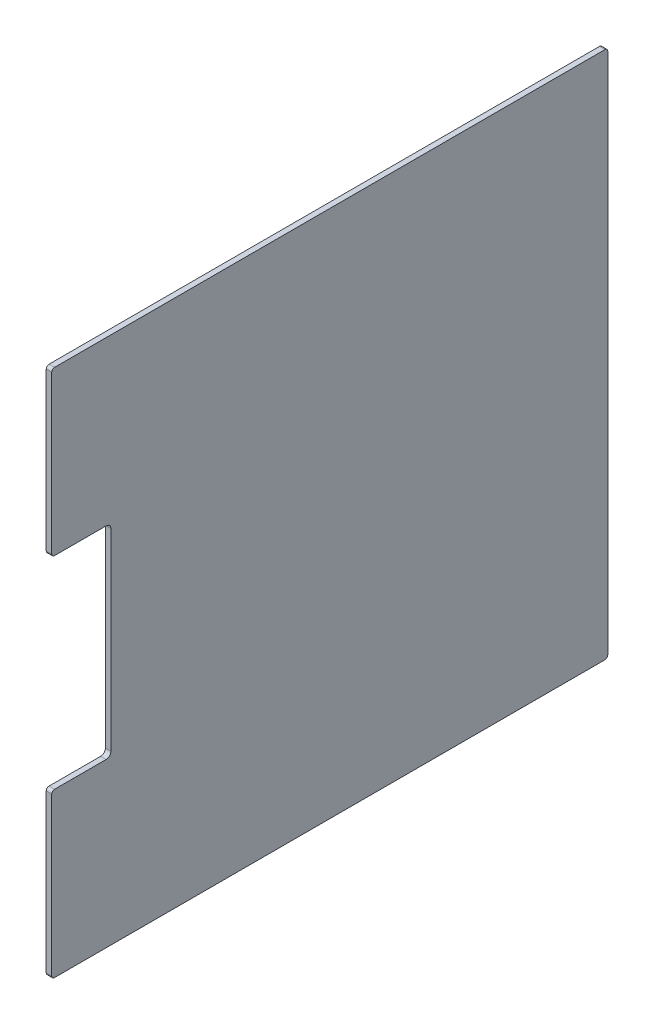
ISO-10303-21;
HEADER;
FILE_DESCRIPTION(('STEP AP214'),'2;1');
FILE_NAME('part.step','',(''),(''),'','','');
FILE_SCHEMA(('AUTOMOTIVE_DESIGN { 1 0 10303 214 1 1 1 1 }'));
ENDSEC;
DATA;
#1=APPLICATION_CONTEXT('core data for automotive mechanical design processes');
#2=APPLICATION_PROTOCOL_DEFINITION('international standard','automotive_design',2000,#1);
#3=PRODUCT_CONTEXT('',#1,'mechanical');
#4=PRODUCT('Part','Part','',(#3));
#5=PRODUCT_RELATED_PRODUCT_CATEGORY('part','',(#4));
#6=PRODUCT_DEFINITION_FORMATION('','',#4);
#7=PRODUCT_DEFINITION_CONTEXT('part definition',#1,'design');
#8=PRODUCT_DEFINITION('design','',#6,#7);
#9=PRODUCT_DEFINITION_SHAPE('','',#8);
#10=(LENGTH_UNIT() NAMED_UNIT(*) SI_UNIT(.MILLI.,.METRE.));
#11=(NAMED_UNIT(*) PLANE_ANGLE_UNIT() SI_UNIT($,.RADIAN.));
#12=(NAMED_UNIT(*) SI_UNIT($,.STERADIAN.) SOLID_ANGLE_UNIT());
#13=UNCERTAINTY_MEASURE_WITH_UNIT(LENGTH_MEASURE(1.E-05),#10,'distance_accuracy_value','');
#14=(GEOMETRIC_REPRESENTATION_CONTEXT(3) GLOBAL_UNCERTAINTY_ASSIGNED_CONTEXT((#13)) GLOBAL_UNIT_ASSIGNED_CONTEXT((#10,
#11,#12)) REPRESENTATION_CONTEXT('',''));
#15=CARTESIAN_POINT('',(0.,0.,0.));
#16=DIRECTION('',(0.,0.,1.));
#17=DIRECTION('',(1.,0.,0.));
#18=AXIS2_PLACEMENT_3D('',#15,#16,#17);
#19=CARTESIAN_POINT('',(-22.4931809643749,28.9773858907143,-41.9999994337558));
#20=DIRECTION('',(0.,0.,-1.));
#21=DIRECTION('',(0.,-1.,0.));
#22=AXIS2_PLACEMENT_3D('',#19,#20,#21);
#23=PLANE('',#22);
#24=DIRECTION('',(1.,0.,0.));
#25=VECTOR('',#24,1.);
#26=CARTESIAN_POINT('',(-22.493180964376,-353.022614019876,-41.9999994337558));
#27=LINE('',#26,#25);
#28=CARTESIAN_POINT('',(-26.493180964376,-353.022614019876,-41.9999994337558));
#29=VERTEX_POINT('',#28);
#30=CARTESIAN_POINT('',(-22.493180964376,-353.022614019876,-41.9999994337558));
#31=VERTEX_POINT('',#30);
#32=EDGE_CURVE('E258',#29,#31,#27,.T.);
#33=ORIENTED_EDGE('',*,*,#32,.F.);
#34=DIRECTION('',(0.,-1.,0.));
#35=VECTOR('',#34,1.);
#36=CARTESIAN_POINT('',(-26.4931809643749,28.9773858907143,-41.9999994337558));
#37=LINE('',#36,#35);
#38=CARTESIAN_POINT('',(-26.4931809643749,26.9773858907143,-41.9999994337558));
#39=VERTEX_POINT('',#38);
#40=EDGE_CURVE('E223',#39,#29,#37,.T.);
#41=ORIENTED_EDGE('',*,*,#40,.F.);
#42=DIRECTION('',(-1.,0.,0.));
#43=VECTOR('',#42,1.);
#44=CARTESIAN_POINT('',(-22.493180964375,26.9773858907143,-41.9999994337558));
#45=LINE('',#44,#43);
#46=CARTESIAN_POINT('',(-22.4931809643749,26.9773858907143,-41.9999994337558));
#47=VERTEX_POINT('',#46);
#48=EDGE_CURVE('E257',#47,#39,#45,.T.);
#49=ORIENTED_EDGE('',*,*,#48,.F.);
#50=DIRECTION('',(0.,-1.,0.));
#51=VECTOR('',#50,1.);
#52=CARTESIAN_POINT('',(-22.4931809643749,28.9773858907143,-41.9999994337558));
#53=LINE('',#52,#51);
#54=EDGE_CURVE('E203',#47,#31,#53,.T.);
#55=ORIENTED_EDGE('',*,*,#54,.T.);
#56=EDGE_LOOP('',(#33,#41,#49,#55));
#57=FACE_BOUND('',#56,.T.);
#58=ADVANCED_FACE('F17',(#57),#23,.T.);
#59=CARTESIAN_POINT('',(-26.4931809643756,-236.499667693611,362.000000476835));
#60=DIRECTION('',(0.,-1.,0.));
#61=DIRECTION('',(-1.,0.,0.));
#62=AXIS2_PLACEMENT_3D('',#59,#60,#61);
#63=PLANE('',#62);
#64=DIRECTION('',(-1.,0.,0.));
#65=VECTOR('',#64,1.);
#66=CARTESIAN_POINT('',(-24.4931809643758,-236.499667693611,360.000000476835));
#67=LINE('',#66,#65);
#68=CARTESIAN_POINT('',(-22.4931809643758,-236.499667693611,360.000000476835));
#69=VERTEX_POINT('',#68);
#70=CARTESIAN_POINT('',(-26.4931809643756,-236.499667693611,360.000000476835));
#71=VERTEX_POINT('',#70);
#72=EDGE_CURVE('E283',#69,#71,#67,.T.);
#73=ORIENTED_EDGE('',*,*,#72,.F.);
#74=DIRECTION('',(0.,0.,1.));
#75=VECTOR('',#74,1.);
#76=CARTESIAN_POINT('',(-22.4931809643758,-236.499667693611,322.5));
#77=LINE('',#76,#75);
#78=CARTESIAN_POINT('',(-22.4931809643758,-236.499667693611,322.5));
#79=VERTEX_POINT('',#78);
#80=EDGE_CURVE('E232',#79,#69,#77,.T.);
#81=ORIENTED_EDGE('',*,*,#80,.F.);
#82=DIRECTION('',(1.,0.,0.));
#83=VECTOR('',#82,1.);
#84=CARTESIAN_POINT('',(-26.4931809643756,-236.499667693611,322.5));
#85=LINE('',#84,#83);
#86=CARTESIAN_POINT('',(-26.4931809643756,-236.499667693611,322.5));
#87=VERTEX_POINT('',#86);
#88=EDGE_CURVE('E304',#87,#79,#85,.T.);
#89=ORIENTED_EDGE('',*,*,#88,.F.);
#90=DIRECTION('',(0.,0.,-1.));
#91=VECTOR('',#90,1.);
#92=CARTESIAN_POINT('',(-26.4931809643756,-236.499667693611,362.000000476835));
#93=LINE('',#92,#91);
#94=EDGE_CURVE('E205',#71,#87,#93,.T.);
#95=ORIENTED_EDGE('',*,*,#94,.F.);
#96=EDGE_LOOP('',(#73,#81,#89,#95));
#97=FACE_BOUND('',#96,.T.);
#98=ADVANCED_FACE('F375',(#97),#63,.F.);
#99=CARTESIAN_POINT('',(-26.4931809643752,-89.4996676936113,322.9));
#100=DIRECTION('',(0.,1.,0.));
#101=DIRECTION('',(0.,0.,-1.));
#102=AXIS2_PLACEMENT_3D('',#99,#100,#101);
#103=PLANE('',#102);
#104=DIRECTION('',(1.,0.,0.));
#105=VECTOR('',#104,1.);
#106=CARTESIAN_POINT('',(-24.4931809643757,-89.4996676936113,360.000000476835));
#107=LINE('',#106,#105);
#108=CARTESIAN_POINT('',(-26.4931809643752,-89.4996676936113,360.000000476835));
#109=VERTEX_POINT('',#108);
#110=CARTESIAN_POINT('',(-22.4931809643753,-89.4996676936113,360.000000476835));
#111=VERTEX_POINT('',#110);
#112=EDGE_CURVE('E285',#109,#111,#107,.T.);
#113=ORIENTED_EDGE('',*,*,#112,.F.);
#114=DIRECTION('',(0.,0.,1.));
#115=VECTOR('',#114,1.);
#116=CARTESIAN_POINT('',(-26.4931809643752,-89.4996676936113,322.5));
#117=LINE('',#116,#115);
#118=CARTESIAN_POINT('',(-26.4931809643752,-89.4996676936113,322.5));
#119=VERTEX_POINT('',#118);
#120=EDGE_CURVE('E310',#119,#109,#117,.T.);
#121=ORIENTED_EDGE('',*,*,#120,.F.);
#122=DIRECTION('',(-1.,0.,0.));
#123=VECTOR('',#122,1.);
#124=CARTESIAN_POINT('',(-22.4931809643754,-89.4996676936113,322.5));
#125=LINE('',#124,#123);
#126=CARTESIAN_POINT('',(-22.4931809643754,-89.4996676936113,322.5));
#127=VERTEX_POINT('',#126);
#128=EDGE_CURVE('E11',#127,#119,#125,.T.);
#129=ORIENTED_EDGE('',*,*,#128,.F.);
#130=DIRECTION('',(0.,0.,-1.));
#131=VECTOR('',#130,1.);
#132=CARTESIAN_POINT('',(-22.4931809643753,-89.4996676936113,362.000000476835));
#133=LINE('',#132,#131);
#134=EDGE_CURVE('E220',#111,#127,#133,.T.);
#135=ORIENTED_EDGE('',*,*,#134,.F.);
#136=EDGE_LOOP('',(#113,#121,#129,#135));
#137=FACE_BOUND('',#136,.T.);
#138=ADVANCED_FACE('F366',(#137),#103,.F.);
#139=CARTESIAN_POINT('',(-26.4931809643752,-92.9996676936113,322.5));
#140=DIRECTION('',(-1.,0.,0.));
#141=DIRECTION('',(0.,0.707106781186551,-0.707106781186544));
#142=AXIS2_PLACEMENT_3D('',#139,#140,#141);
#143=CYLINDRICAL_SURFACE('',#142,3.5);
#144=CARTESIAN_POINT('',(-22.4931809643755,-92.9996676936113,322.5));
#145=DIRECTION('',(1.,0.,0.));
#146=DIRECTION('',(0.,0.707106781186551,-0.707106781186544));
#147=AXIS2_PLACEMENT_3D('',#144,#145,#146);
#148=CIRCLE('',#147,3.5);
#149=CARTESIAN_POINT('',(-22.4931809643754,-92.9996676936113,319.));
#150=VERTEX_POINT('',#149);
#151=EDGE_CURVE('E216',#150,#127,#148,.T.);
#152=ORIENTED_EDGE('',*,*,#151,.T.);
#153=ORIENTED_EDGE('',*,*,#128,.T.);
#154=CARTESIAN_POINT('',(-26.4931809643754,-92.9996676936113,322.5));
#155=DIRECTION('',(-1.,0.,0.));
#156=DIRECTION('',(0.,0.707106781186551,-0.707106781186544));
#157=AXIS2_PLACEMENT_3D('',#154,#155,#156);
#158=CIRCLE('',#157,3.5);
#159=CARTESIAN_POINT('',(-26.4931809643752,-92.9996676936113,319.));
#160=VERTEX_POINT('',#159);
#161=EDGE_CURVE('E313',#119,#160,#158,.T.);
#162=ORIENTED_EDGE('',*,*,#161,.T.);
#163=DIRECTION('',(1.,0.,0.));
#164=VECTOR('',#163,1.);
#165=CARTESIAN_POINT('',(-26.4931809643752,-92.9996676936113,319.));
#166=LINE('',#165,#164);
#167=EDGE_CURVE('E28',#160,#150,#166,.T.);
#168=ORIENTED_EDGE('',*,*,#167,.T.);
#169=EDGE_LOOP('',(#152,#153,#162,#168));
#170=FACE_BOUND('',#169,.T.);
#171=ADVANCED_FACE('F364',(#170),#143,.F.);
#172=CARTESIAN_POINT('',(-26.4931809643753,-98.7996676936113,319.));
#173=DIRECTION('',(0.,0.,-1.));
#174=DIRECTION('',(0.,-1.,0.));
#175=AXIS2_PLACEMENT_3D('',#172,#173,#174);
#176=PLANE('',#175);
#177=DIRECTION('',(-1.,0.,0.));
#178=VECTOR('',#177,1.);
#179=CARTESIAN_POINT('',(-22.4931809643758,-232.999667693611,319.));
#180=LINE('',#179,#178);
#181=CARTESIAN_POINT('',(-22.4931809643758,-232.999667693611,319.));
#182=VERTEX_POINT('',#181);
#183=CARTESIAN_POINT('',(-26.4931809643756,-232.999667693611,319.));
#184=VERTEX_POINT('',#183);
#185=EDGE_CURVE('E264',#182,#184,#180,.T.);
#186=ORIENTED_EDGE('',*,*,#185,.F.);
#187=DIRECTION('',(0.,-1.,0.));
#188=VECTOR('',#187,1.);
#189=CARTESIAN_POINT('',(-22.4931809643754,-92.9996676936113,319.));
#190=LINE('',#189,#188);
#191=EDGE_CURVE('E219',#150,#182,#190,.T.);
#192=ORIENTED_EDGE('',*,*,#191,.F.);
#193=ORIENTED_EDGE('',*,*,#167,.F.);
#194=DIRECTION('',(0.,1.,0.));
#195=VECTOR('',#194,1.);
#196=CARTESIAN_POINT('',(-26.4931809643756,-232.999667693611,319.));
#197=LINE('',#196,#195);
#198=EDGE_CURVE('E274',#184,#160,#197,.T.);
#199=ORIENTED_EDGE('',*,*,#198,.F.);
#200=EDGE_LOOP('',(#186,#192,#193,#199));
#201=FACE_BOUND('',#200,.T.);
#202=ADVANCED_FACE('F360',(#201),#176,.F.);
#203=CARTESIAN_POINT('',(-26.4931809643754,-232.999667693611,322.5));
#204=DIRECTION('',(-1.,0.,0.));
#205=DIRECTION('',(0.,-0.70710678118654,-0.707106781186555));
#206=AXIS2_PLACEMENT_3D('',#203,#204,#205);
#207=CYLINDRICAL_SURFACE('',#206,3.5);
#208=CARTESIAN_POINT('',(-22.4931809643755,-232.999667693611,322.5));
#209=DIRECTION('',(1.,0.,0.));
#210=DIRECTION('',(0.,-0.70710678118654,-0.707106781186555));
#211=AXIS2_PLACEMENT_3D('',#208,#209,#210);
#212=CIRCLE('',#211,3.5);
#213=EDGE_CURVE('E244',#79,#182,#212,.T.);
#214=ORIENTED_EDGE('',*,*,#213,.T.);
#215=ORIENTED_EDGE('',*,*,#185,.T.);
#216=CARTESIAN_POINT('',(-26.4931809643754,-232.999667693611,322.5));
#217=DIRECTION('',(-1.,0.,0.));
#218=DIRECTION('',(0.,-0.70710678118654,-0.707106781186555));
#219=AXIS2_PLACEMENT_3D('',#216,#217,#218);
#220=CIRCLE('',#219,3.5);
#221=EDGE_CURVE('E209',#184,#87,#220,.T.);
#222=ORIENTED_EDGE('',*,*,#221,.T.);
#223=ORIENTED_EDGE('',*,*,#88,.T.);
#224=EDGE_LOOP('',(#214,#215,#222,#223));
#225=FACE_BOUND('',#224,.T.);
#226=ADVANCED_FACE('F373',(#225),#207,.F.);
#227=CARTESIAN_POINT('',(-22.4931809643751,28.9773858907143,362.000000476835));
#228=DIRECTION('',(0.,1.,0.));
#229=DIRECTION('',(0.,0.,-1.));
#230=AXIS2_PLACEMENT_3D('',#227,#228,#229);
#231=PLANE('',#230);
#232=DIRECTION('',(-1.,0.,0.));
#233=VECTOR('',#232,1.);
#234=CARTESIAN_POINT('',(-22.4931809643756,28.9773858907143,360.000000476835));
#235=LINE('',#234,#233);
#236=CARTESIAN_POINT('',(-22.4931809643751,28.9773858907143,360.000000476835));
#237=VERTEX_POINT('',#236);
#238=CARTESIAN_POINT('',(-26.4931809643749,28.9773858907144,360.000000476835));
#239=VERTEX_POINT('',#238);
#240=EDGE_CURVE('E169',#237,#239,#235,.T.);
#241=ORIENTED_EDGE('',*,*,#240,.F.);
#242=DIRECTION('',(0.,0.,-1.));
#243=VECTOR('',#242,1.);
#244=CARTESIAN_POINT('',(-22.4931809643751,28.9773858907143,362.000000476835));
#245=LINE('',#244,#243);
#246=CARTESIAN_POINT('',(-22.493180964375,28.9773858907143,-39.9999994337558));
#247=VERTEX_POINT('',#246);
#248=EDGE_CURVE('E215',#237,#247,#245,.T.);
#249=ORIENTED_EDGE('',*,*,#248,.T.);
#250=DIRECTION('',(1.,0.,0.));
#251=VECTOR('',#250,1.);
#252=CARTESIAN_POINT('',(-22.493180964375,28.9773858907143,-39.9999994337558));
#253=LINE('',#252,#251);
#254=CARTESIAN_POINT('',(-26.4931809643749,28.9773858907144,-39.9999994337558));
#255=VERTEX_POINT('',#254);
#256=EDGE_CURVE('E171',#255,#247,#253,.T.);
#257=ORIENTED_EDGE('',*,*,#256,.F.);
#258=DIRECTION('',(0.,0.,-1.));
#259=VECTOR('',#258,1.);
#260=CARTESIAN_POINT('',(-26.4931809643749,28.9773858907144,362.000000476835));
#261=LINE('',#260,#259);
#262=EDGE_CURVE('E165',#239,#255,#261,.T.);
#263=ORIENTED_EDGE('',*,*,#262,.F.);
#264=EDGE_LOOP('',(#241,#249,#257,#263));
#265=FACE_BOUND('',#264,.T.);
#266=ADVANCED_FACE('F167',(#265),#231,.T.);
#267=CARTESIAN_POINT('',(-22.493180964375,26.9773858907143,-39.9999994337558));
#268=DIRECTION('',(-1.,0.,0.));
#269=DIRECTION('',(0.,0.707106781186548,-0.707106781186548));
#270=AXIS2_PLACEMENT_3D('',#267,#268,#269);
#271=CYLINDRICAL_SURFACE('',#270,2.);
#272=CARTESIAN_POINT('',(-26.4931809643754,26.9773858907143,-39.9999994337558));
#273=DIRECTION('',(1.,0.,0.));
#274=DIRECTION('',(0.,0.707106781186548,-0.707106781186548));
#275=AXIS2_PLACEMENT_3D('',#272,#273,#274);
#276=CIRCLE('',#275,2.);
#277=EDGE_CURVE('E175',#39,#255,#276,.T.);
#278=ORIENTED_EDGE('',*,*,#277,.T.);
#279=ORIENTED_EDGE('',*,*,#256,.T.);
#280=CARTESIAN_POINT('',(-22.4931809643755,26.9773858907143,-39.9999994337558));
#281=DIRECTION('',(-1.,0.,0.));
#282=DIRECTION('',(0.,0.707106781186548,-0.707106781186548));
#283=AXIS2_PLACEMENT_3D('',#280,#281,#282);
#284=CIRCLE('',#283,2.);
#285=EDGE_CURVE('E211',#247,#47,#284,.T.);
#286=ORIENTED_EDGE('',*,*,#285,.T.);
#287=ORIENTED_EDGE('',*,*,#48,.T.);
#288=EDGE_LOOP('',(#278,#279,#286,#287));
#289=FACE_BOUND('',#288,.T.);
#290=ADVANCED_FACE('F391',(#289),#271,.T.);
#291=CARTESIAN_POINT('',(-22.493180964376,-353.022614019876,-39.9999994337558));
#292=DIRECTION('',(-1.,0.,0.));
#293=DIRECTION('',(0.,-0.707106781186552,-0.707106781186543));
#294=AXIS2_PLACEMENT_3D('',#291,#292,#293);
#295=CYLINDRICAL_SURFACE('',#294,2.);
#296=CARTESIAN_POINT('',(-26.4931809643759,-353.022614019876,-39.9999994337558));
#297=DIRECTION('',(1.,0.,0.));
#298=DIRECTION('',(0.,-0.707106781186552,-0.707106781186543));
#299=AXIS2_PLACEMENT_3D('',#296,#297,#298);
#300=CIRCLE('',#299,2.);
#301=CARTESIAN_POINT('',(-26.4931809643759,-355.022614019876,-39.9999994337558));
#302=VERTEX_POINT('',#301);
#303=EDGE_CURVE('E303',#302,#29,#300,.T.);
#304=ORIENTED_EDGE('',*,*,#303,.T.);
#305=ORIENTED_EDGE('',*,*,#32,.T.);
#306=CARTESIAN_POINT('',(-22.493180964376,-353.022614019876,-39.9999994337558));
#307=DIRECTION('',(-1.,0.,0.));
#308=DIRECTION('',(0.,-0.707106781186552,-0.707106781186543));
#309=AXIS2_PLACEMENT_3D('',#306,#307,#308);
#310=CIRCLE('',#309,2.);
#311=CARTESIAN_POINT('',(-22.493180964376,-355.022614019876,-39.9999994337558));
#312=VERTEX_POINT('',#311);
#313=EDGE_CURVE('E199',#31,#312,#310,.T.);
#314=ORIENTED_EDGE('',*,*,#313,.T.);
#315=DIRECTION('',(-1.,0.,0.));
#316=VECTOR('',#315,1.);
#317=CARTESIAN_POINT('',(-22.493180964376,-355.022614019876,-39.9999994337558));
#318=LINE('',#317,#316);
#319=EDGE_CURVE('E255',#312,#302,#318,.T.);
#320=ORIENTED_EDGE('',*,*,#319,.T.);
#321=EDGE_LOOP('',(#304,#305,#314,#320));
#322=FACE_BOUND('',#321,.T.);
#323=ADVANCED_FACE('F389',(#322),#295,.T.);
#324=CARTESIAN_POINT('',(-22.493180964376,-355.022614019876,-41.9999994337558));
#325=DIRECTION('',(0.,-1.,0.));
#326=DIRECTION('',(-1.,0.,0.));
#327=AXIS2_PLACEMENT_3D('',#324,#325,#326);
#328=PLANE('',#327);
#329=DIRECTION('',(1.,0.,0.));
#330=VECTOR('',#329,1.);
#331=CARTESIAN_POINT('',(-22.4931809643761,-355.022614019876,360.000000476835));
#332=LINE('',#331,#330);
#333=CARTESIAN_POINT('',(-26.4931809643759,-355.022614019876,360.000000476835));
#334=VERTEX_POINT('',#333);
#335=CARTESIAN_POINT('',(-22.4931809643761,-355.022614019876,360.000000476835));
#336=VERTEX_POINT('',#335);
#337=EDGE_CURVE('E21',#334,#336,#332,.T.);
#338=ORIENTED_EDGE('',*,*,#337,.F.);
#339=DIRECTION('',(0.,0.,1.));
#340=VECTOR('',#339,1.);
#341=CARTESIAN_POINT('',(-26.4931809643759,-355.022614019876,-41.9999994337558));
#342=LINE('',#341,#340);
#343=EDGE_CURVE('E299',#302,#334,#342,.T.);
#344=ORIENTED_EDGE('',*,*,#343,.F.);
#345=ORIENTED_EDGE('',*,*,#319,.F.);
#346=DIRECTION('',(0.,0.,1.));
#347=VECTOR('',#346,1.);
#348=CARTESIAN_POINT('',(-22.493180964376,-355.022614019876,-41.9999994337558));
#349=LINE('',#348,#347);
#350=EDGE_CURVE('E204',#312,#336,#349,.T.);
#351=ORIENTED_EDGE('',*,*,#350,.T.);
#352=EDGE_LOOP('',(#338,#344,#345,#351));
#353=FACE_BOUND('',#352,.T.);
#354=ADVANCED_FACE('F19',(#353),#328,.T.);
#355=CARTESIAN_POINT('',(-22.493180964376,-353.022614019876,360.000000476835));
#356=DIRECTION('',(-1.,0.,0.));
#357=DIRECTION('',(0.,-0.707106781186548,0.707106781186548));
#358=AXIS2_PLACEMENT_3D('',#355,#356,#357);
#359=CYLINDRICAL_SURFACE('',#358,2.);
#360=CARTESIAN_POINT('',(-26.4931809643759,-353.022614019876,360.000000476835));
#361=DIRECTION('',(1.,0.,0.));
#362=DIRECTION('',(0.,-0.707106781186548,0.707106781186548));
#363=AXIS2_PLACEMENT_3D('',#360,#361,#362);
#364=CIRCLE('',#363,2.);
#365=CARTESIAN_POINT('',(-26.493180964376,-353.022614019876,362.000000476835));
#366=VERTEX_POINT('',#365);
#367=EDGE_CURVE('E210',#366,#334,#364,.T.);
#368=ORIENTED_EDGE('',*,*,#367,.T.);
#369=ORIENTED_EDGE('',*,*,#337,.T.);
#370=CARTESIAN_POINT('',(-22.493180964376,-353.022614019876,360.000000476835));
#371=DIRECTION('',(-1.,0.,0.));
#372=DIRECTION('',(0.,-0.707106781186548,0.707106781186548));
#373=AXIS2_PLACEMENT_3D('',#370,#371,#372);
#374=CIRCLE('',#373,2.);
#375=CARTESIAN_POINT('',(-22.4931809643761,-353.022614019876,362.000000476835));
#376=VERTEX_POINT('',#375);
#377=EDGE_CURVE('E242',#336,#376,#374,.T.);
#378=ORIENTED_EDGE('',*,*,#377,.T.);
#379=DIRECTION('',(-1.,0.,0.));
#380=VECTOR('',#379,1.);
#381=CARTESIAN_POINT('',(-22.493180964376,-353.022614019876,362.000000476835));
#382=LINE('',#381,#380);
#383=EDGE_CURVE('E176',#376,#366,#382,.T.);
#384=ORIENTED_EDGE('',*,*,#383,.T.);
#385=EDGE_LOOP('',(#368,#369,#378,#384));
#386=FACE_BOUND('',#385,.T.);
#387=ADVANCED_FACE('F396',(#386),#359,.T.);
#388=CARTESIAN_POINT('',(-26.4931809643754,-163.022614064581,159.97738368099));
#389=DIRECTION('',(-1.,0.,0.));
#390=DIRECTION('',(0.,0.,1.));
#391=AXIS2_PLACEMENT_3D('',#388,#389,#390);
#392=PLANE('',#391);
#393=CARTESIAN_POINT('',(-26.4931809643754,26.9773858907143,360.000000476835));
#394=DIRECTION('',(1.,0.,0.));
#395=DIRECTION('',(0.,0.707106781186541,0.707106781186554));
#396=AXIS2_PLACEMENT_3D('',#393,#394,#395);
#397=CIRCLE('',#396,2.);
#398=CARTESIAN_POINT('',(-26.4931809643749,26.9773858907143,362.000000476835));
#399=VERTEX_POINT('',#398);
#400=EDGE_CURVE('E182',#239,#399,#397,.T.);
#401=ORIENTED_EDGE('',*,*,#400,.F.);
#402=ORIENTED_EDGE('',*,*,#262,.T.);
#403=ORIENTED_EDGE('',*,*,#277,.F.);
#404=ORIENTED_EDGE('',*,*,#40,.T.);
#405=ORIENTED_EDGE('',*,*,#303,.F.);
#406=ORIENTED_EDGE('',*,*,#343,.T.);
#407=ORIENTED_EDGE('',*,*,#367,.F.);
#408=DIRECTION('',(0.,1.,0.));
#409=VECTOR('',#408,1.);
#410=CARTESIAN_POINT('',(-26.493180964376,-355.022614019876,362.000000476835));
#411=LINE('',#410,#409);
#412=CARTESIAN_POINT('',(-26.4931809643756,-238.499667693611,362.000000476835));
#413=VERTEX_POINT('',#412);
#414=EDGE_CURVE('E288',#366,#413,#411,.T.);
#415=ORIENTED_EDGE('',*,*,#414,.T.);
#416=CARTESIAN_POINT('',(-26.4931809643754,-238.499667693611,360.000000476835));
#417=DIRECTION('',(1.,0.,0.));
#418=DIRECTION('',(0.,0.707106781186535,0.70710678118656));
#419=AXIS2_PLACEMENT_3D('',#416,#417,#418);
#420=CIRCLE('',#419,2.);
#421=EDGE_CURVE('E284',#71,#413,#420,.T.);
#422=ORIENTED_EDGE('',*,*,#421,.F.);
#423=ORIENTED_EDGE('',*,*,#94,.T.);
#424=ORIENTED_EDGE('',*,*,#221,.F.);
#425=ORIENTED_EDGE('',*,*,#198,.T.);
#426=ORIENTED_EDGE('',*,*,#161,.F.);
#427=ORIENTED_EDGE('',*,*,#120,.T.);
#428=CARTESIAN_POINT('',(-26.4931809643754,-87.4996676936113,360.000000476835));
#429=DIRECTION('',(1.,0.,0.));
#430=DIRECTION('',(0.,-0.707106781186541,0.707106781186554));
#431=AXIS2_PLACEMENT_3D('',#428,#429,#430);
#432=CIRCLE('',#431,2.);
#433=CARTESIAN_POINT('',(-26.4931809643752,-87.4996676936113,362.000000476835));
#434=VERTEX_POINT('',#433);
#435=EDGE_CURVE('E227',#434,#109,#432,.T.);
#436=ORIENTED_EDGE('',*,*,#435,.F.);
#437=DIRECTION('',(0.,1.,0.));
#438=VECTOR('',#437,1.);
#439=CARTESIAN_POINT('',(-26.4931809643752,-89.4996676936113,362.000000476835));
#440=LINE('',#439,#438);
#441=EDGE_CURVE('E157',#434,#399,#440,.T.);
#442=ORIENTED_EDGE('',*,*,#441,.T.);
#443=EDGE_LOOP('',(#401,#402,#403,#404,#405,#406,#407,#415,#422,#423,#424,#425,#426,#427,#436,#442));
#444=FACE_BOUND('',#443,.T.);
#445=ADVANCED_FACE('F188',(#444),#392,.T.);
#446=CARTESIAN_POINT('',(-22.4931809643761,-355.022614019876,362.000000476835));
#447=DIRECTION('',(0.,0.,1.));
#448=DIRECTION('',(0.,-1.,0.));
#449=AXIS2_PLACEMENT_3D('',#446,#447,#448);
#450=PLANE('',#449);
#451=DIRECTION('',(1.,0.,0.));
#452=VECTOR('',#451,1.);
#453=CARTESIAN_POINT('',(-24.4931809643758,-238.499667693611,362.000000476835));
#454=LINE('',#453,#452);
#455=CARTESIAN_POINT('',(-22.4931809643758,-238.499667693611,362.000000476835));
#456=VERTEX_POINT('',#455);
#457=EDGE_CURVE('E280',#413,#456,#454,.T.);
#458=ORIENTED_EDGE('',*,*,#457,.F.);
#459=ORIENTED_EDGE('',*,*,#414,.F.);
#460=ORIENTED_EDGE('',*,*,#383,.F.);
#461=DIRECTION('',(0.,1.,0.));
#462=VECTOR('',#461,1.);
#463=CARTESIAN_POINT('',(-22.4931809643761,-355.022614019876,362.000000476835));
#464=LINE('',#463,#462);
#465=EDGE_CURVE('E231',#376,#456,#464,.T.);
#466=ORIENTED_EDGE('',*,*,#465,.T.);
#467=EDGE_LOOP('',(#458,#459,#460,#466));
#468=FACE_BOUND('',#467,.T.);
#469=ADVANCED_FACE('F414',(#468),#450,.T.);
#470=CARTESIAN_POINT('',(-24.4931809643758,-238.499667693611,360.000000476835));
#471=DIRECTION('',(-1.,0.,0.));
#472=DIRECTION('',(0.,0.707106781186535,0.70710678118656));
#473=AXIS2_PLACEMENT_3D('',#470,#471,#472);
#474=CYLINDRICAL_SURFACE('',#473,2.);
#475=ORIENTED_EDGE('',*,*,#421,.T.);
#476=ORIENTED_EDGE('',*,*,#457,.T.);
#477=CARTESIAN_POINT('',(-22.4931809643755,-238.499667693611,360.000000476835));
#478=DIRECTION('',(-1.,0.,0.));
#479=DIRECTION('',(0.,0.707106781186535,0.70710678118656));
#480=AXIS2_PLACEMENT_3D('',#477,#478,#479);
#481=CIRCLE('',#480,2.);
#482=EDGE_CURVE('E228',#456,#69,#481,.T.);
#483=ORIENTED_EDGE('',*,*,#482,.T.);
#484=ORIENTED_EDGE('',*,*,#72,.T.);
#485=EDGE_LOOP('',(#475,#476,#483,#484));
#486=FACE_BOUND('',#485,.T.);
#487=ADVANCED_FACE('F415',(#486),#474,.T.);
#488=CARTESIAN_POINT('',(-24.4931809643757,-87.4996676936113,360.000000476835));
#489=DIRECTION('',(1.,0.,0.));
#490=DIRECTION('',(0.,-0.707106781186541,0.707106781186554));
#491=AXIS2_PLACEMENT_3D('',#488,#489,#490);
#492=CYLINDRICAL_SURFACE('',#491,2.);
#493=CARTESIAN_POINT('',(-22.4931809643755,-87.4996676936113,360.000000476835));
#494=DIRECTION('',(-1.,0.,0.));
#495=DIRECTION('',(0.,-0.707106781186541,0.707106781186554));
#496=AXIS2_PLACEMENT_3D('',#493,#494,#495);
#497=CIRCLE('',#496,2.);
#498=CARTESIAN_POINT('',(-22.4931809643754,-87.4996676936113,362.000000476835));
#499=VERTEX_POINT('',#498);
#500=EDGE_CURVE('E298',#111,#499,#497,.T.);
#501=ORIENTED_EDGE('',*,*,#500,.T.);
#502=DIRECTION('',(-1.,0.,0.));
#503=VECTOR('',#502,1.);
#504=CARTESIAN_POINT('',(-24.4931809643757,-87.4996676936113,362.000000476835));
#505=LINE('',#504,#503);
#506=EDGE_CURVE('E224',#499,#434,#505,.T.);
#507=ORIENTED_EDGE('',*,*,#506,.T.);
#508=ORIENTED_EDGE('',*,*,#435,.T.);
#509=ORIENTED_EDGE('',*,*,#112,.T.);
#510=EDGE_LOOP('',(#501,#507,#508,#509));
#511=FACE_BOUND('',#510,.T.);
#512=ADVANCED_FACE('F387',(#511),#492,.T.);
#513=CARTESIAN_POINT('',(-22.4931809643761,-355.022614019876,362.000000476835));
#514=DIRECTION('',(0.,0.,1.));
#515=DIRECTION('',(0.,-1.,0.));
#516=AXIS2_PLACEMENT_3D('',#513,#514,#515);
#517=PLANE('',#516);
#518=DIRECTION('',(1.,0.,0.));
#519=VECTOR('',#518,1.);
#520=CARTESIAN_POINT('',(-22.4931809643756,26.9773858907143,362.000000476835));
#521=LINE('',#520,#519);
#522=CARTESIAN_POINT('',(-22.493180964375,26.9773858907143,362.000000476835));
#523=VERTEX_POINT('',#522);
#524=EDGE_CURVE('E190',#399,#523,#521,.T.);
#525=ORIENTED_EDGE('',*,*,#524,.F.);
#526=ORIENTED_EDGE('',*,*,#441,.F.);
#527=ORIENTED_EDGE('',*,*,#506,.F.);
#528=DIRECTION('',(0.,1.,0.));
#529=VECTOR('',#528,1.);
#530=CARTESIAN_POINT('',(-22.4931809643754,-89.4996676936113,362.000000476835));
#531=LINE('',#530,#529);
#532=EDGE_CURVE('E186',#499,#523,#531,.T.);
#533=ORIENTED_EDGE('',*,*,#532,.T.);
#534=EDGE_LOOP('',(#525,#526,#527,#533));
#535=FACE_BOUND('',#534,.T.);
#536=ADVANCED_FACE('F425',(#535),#517,.T.);
#537=CARTESIAN_POINT('',(-22.4931809643755,-163.022614064581,159.97738368099));
#538=DIRECTION('',(-1.,0.,0.));
#539=DIRECTION('',(0.,0.,1.));
#540=AXIS2_PLACEMENT_3D('',#537,#538,#539);
#541=PLANE('',#540);
#542=CARTESIAN_POINT('',(-22.4931809643755,26.9773858907143,360.000000476835));
#543=DIRECTION('',(-1.,0.,0.));
#544=DIRECTION('',(0.,0.707106781186541,0.707106781186554));
#545=AXIS2_PLACEMENT_3D('',#542,#543,#544);
#546=CIRCLE('',#545,2.);
#547=EDGE_CURVE('E184',#523,#237,#546,.T.);
#548=ORIENTED_EDGE('',*,*,#547,.F.);
#549=ORIENTED_EDGE('',*,*,#532,.F.);
#550=ORIENTED_EDGE('',*,*,#500,.F.);
#551=ORIENTED_EDGE('',*,*,#134,.T.);
#552=ORIENTED_EDGE('',*,*,#151,.F.);
#553=ORIENTED_EDGE('',*,*,#191,.T.);
#554=ORIENTED_EDGE('',*,*,#213,.F.);
#555=ORIENTED_EDGE('',*,*,#80,.T.);
#556=ORIENTED_EDGE('',*,*,#482,.F.);
#557=ORIENTED_EDGE('',*,*,#465,.F.);
#558=ORIENTED_EDGE('',*,*,#377,.F.);
#559=ORIENTED_EDGE('',*,*,#350,.F.);
#560=ORIENTED_EDGE('',*,*,#313,.F.);
#561=ORIENTED_EDGE('',*,*,#54,.F.);
#562=ORIENTED_EDGE('',*,*,#285,.F.);
#563=ORIENTED_EDGE('',*,*,#248,.F.);
#564=EDGE_LOOP('',(#548,#549,#550,#551,#552,#553,#554,#555,#556,#557,#558,#559,#560,#561,#562,#563));
#565=FACE_BOUND('',#564,.T.);
#566=ADVANCED_FACE('F406',(#565),#541,.F.);
#567=CARTESIAN_POINT('',(-22.4931809643756,26.9773858907143,360.000000476835));
#568=DIRECTION('',(-1.,0.,0.));
#569=DIRECTION('',(0.,0.707106781186541,0.707106781186554));
#570=AXIS2_PLACEMENT_3D('',#567,#568,#569);
#571=CYLINDRICAL_SURFACE('',#570,2.);
#572=ORIENTED_EDGE('',*,*,#400,.T.);
#573=ORIENTED_EDGE('',*,*,#524,.T.);
#574=ORIENTED_EDGE('',*,*,#547,.T.);
#575=ORIENTED_EDGE('',*,*,#240,.T.);
#576=EDGE_LOOP('',(#572,#573,#574,#575));
#577=FACE_BOUND('',#576,.T.);
#578=ADVANCED_FACE('F180',(#577),#571,.T.);
#579=CLOSED_SHELL('',(#58,#98,#138,#171,#202,#226,#266,#290,#323,#354,#387,#445,#469,#487,#512,
#536,#566,#578));
#580=MANIFOLD_SOLID_BREP('B1',#579);
#581=ADVANCED_BREP_SHAPE_REPRESENTATION('',(#18,#580),#14);
#582=SHAPE_DEFINITION_REPRESENTATION(#9,#581);
ENDSEC;
END-ISO-10303-21;
